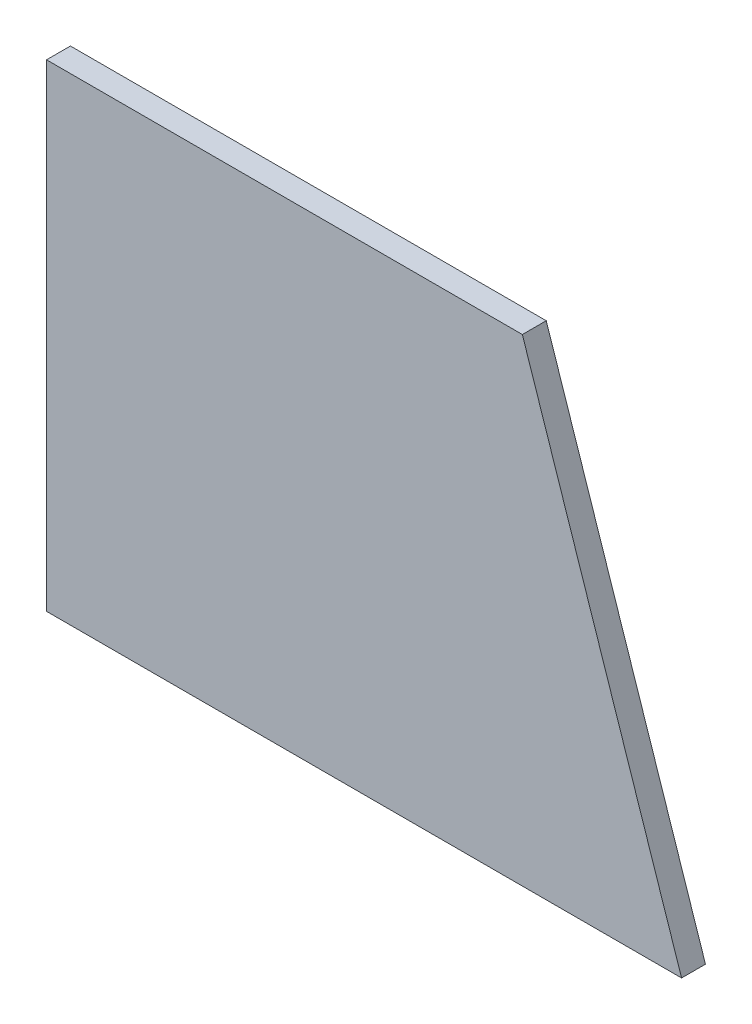
ISO-10303-21;
HEADER;
FILE_DESCRIPTION(('STEP AP214'),'2;1');
FILE_NAME('part.step','',(''),(''),'','','');
FILE_SCHEMA(('AUTOMOTIVE_DESIGN { 1 0 10303 214 1 1 1 1 }'));
ENDSEC;
DATA;
#1=APPLICATION_CONTEXT('core data for automotive mechanical design processes');
#2=APPLICATION_PROTOCOL_DEFINITION('international standard','automotive_design',2000,#1);
#3=PRODUCT_CONTEXT('',#1,'mechanical');
#4=PRODUCT('Part','Part','',(#3));
#5=PRODUCT_RELATED_PRODUCT_CATEGORY('part','',(#4));
#6=PRODUCT_DEFINITION_FORMATION('','',#4);
#7=PRODUCT_DEFINITION_CONTEXT('part definition',#1,'design');
#8=PRODUCT_DEFINITION('design','',#6,#7);
#9=PRODUCT_DEFINITION_SHAPE('','',#8);
#10=(LENGTH_UNIT() NAMED_UNIT(*) SI_UNIT(.MILLI.,.METRE.));
#11=(NAMED_UNIT(*) PLANE_ANGLE_UNIT() SI_UNIT($,.RADIAN.));
#12=(NAMED_UNIT(*) SI_UNIT($,.STERADIAN.) SOLID_ANGLE_UNIT());
#13=UNCERTAINTY_MEASURE_WITH_UNIT(LENGTH_MEASURE(1.E-05),#10,'distance_accuracy_value','');
#14=(GEOMETRIC_REPRESENTATION_CONTEXT(3) GLOBAL_UNCERTAINTY_ASSIGNED_CONTEXT((#13)) GLOBAL_UNIT_ASSIGNED_CONTEXT((#10,
#11,#12)) REPRESENTATION_CONTEXT('',''));
#15=CARTESIAN_POINT('',(0.,0.,0.));
#16=DIRECTION('',(0.,0.,1.));
#17=DIRECTION('',(1.,0.,0.));
#18=AXIS2_PLACEMENT_3D('',#15,#16,#17);
#19=CARTESIAN_POINT('',(-0.3,-0.25,0.015));
#20=DIRECTION('',(1.,0.,0.));
#21=DIRECTION('',(0.,0.,-1.));
#22=AXIS2_PLACEMENT_3D('',#19,#20,#21);
#23=PLANE('',#22);
#24=DIRECTION('',(0.,-1.,0.));
#25=VECTOR('',#24,1.);
#26=CARTESIAN_POINT('',(-0.3,-0.25,-0.015));
#27=LINE('',#26,#25);
#28=CARTESIAN_POINT('',(-0.3,0.35,-0.015));
#29=VERTEX_POINT('',#28);
#30=CARTESIAN_POINT('',(-0.3,-0.25,-0.015));
#31=VERTEX_POINT('',#30);
#32=EDGE_CURVE('E87',#29,#31,#27,.T.);
#33=ORIENTED_EDGE('',*,*,#32,.T.);
#34=DIRECTION('',(0.,0.,-1.));
#35=VECTOR('',#34,1.);
#36=CARTESIAN_POINT('',(-0.3,-0.25,0.015));
#37=LINE('',#36,#35);
#38=CARTESIAN_POINT('',(-0.3,-0.25,0.015));
#39=VERTEX_POINT('',#38);
#40=EDGE_CURVE('E41',#39,#31,#37,.T.);
#41=ORIENTED_EDGE('',*,*,#40,.F.);
#42=DIRECTION('',(0.,-1.,0.));
#43=VECTOR('',#42,1.);
#44=CARTESIAN_POINT('',(-0.3,-0.25,0.015));
#45=LINE('',#44,#43);
#46=CARTESIAN_POINT('',(-0.3,0.35,0.015));
#47=VERTEX_POINT('',#46);
#48=EDGE_CURVE('E80',#47,#39,#45,.T.);
#49=ORIENTED_EDGE('',*,*,#48,.F.);
#50=DIRECTION('',(0.,0.,-1.));
#51=VECTOR('',#50,1.);
#52=CARTESIAN_POINT('',(-0.3,0.35,0.015));
#53=LINE('',#52,#51);
#54=EDGE_CURVE('E11',#47,#29,#53,.T.);
#55=ORIENTED_EDGE('',*,*,#54,.T.);
#56=EDGE_LOOP('',(#33,#41,#49,#55));
#57=FACE_BOUND('',#56,.T.);
#58=ADVANCED_FACE('F33',(#57),#23,.F.);
#59=CARTESIAN_POINT('',(0.497683813287983,-0.25,0.015));
#60=DIRECTION('',(0.,1.,0.));
#61=DIRECTION('',(-1.,0.,0.));
#62=AXIS2_PLACEMENT_3D('',#59,#60,#61);
#63=PLANE('',#62);
#64=DIRECTION('',(1.,0.,0.));
#65=VECTOR('',#64,1.);
#66=CARTESIAN_POINT('',(0.497683813287983,-0.25,-0.015));
#67=LINE('',#66,#65);
#68=CARTESIAN_POINT('',(0.497683813287983,-0.25,-0.015));
#69=VERTEX_POINT('',#68);
#70=EDGE_CURVE('E67',#31,#69,#67,.T.);
#71=ORIENTED_EDGE('',*,*,#70,.T.);
#72=DIRECTION('',(0.,0.,-1.));
#73=VECTOR('',#72,1.);
#74=CARTESIAN_POINT('',(0.497683813287983,-0.25,0.015));
#75=LINE('',#74,#73);
#76=CARTESIAN_POINT('',(0.497683813287983,-0.25,0.015));
#77=VERTEX_POINT('',#76);
#78=EDGE_CURVE('E88',#77,#69,#75,.T.);
#79=ORIENTED_EDGE('',*,*,#78,.F.);
#80=DIRECTION('',(1.,0.,0.));
#81=VECTOR('',#80,1.);
#82=CARTESIAN_POINT('',(0.497683813287983,-0.25,0.015));
#83=LINE('',#82,#81);
#84=EDGE_CURVE('E84',#39,#77,#83,.T.);
#85=ORIENTED_EDGE('',*,*,#84,.F.);
#86=ORIENTED_EDGE('',*,*,#40,.T.);
#87=EDGE_LOOP('',(#71,#79,#85,#86));
#88=FACE_BOUND('',#87,.T.);
#89=ADVANCED_FACE('F89',(#88),#63,.F.);
#90=CARTESIAN_POINT('',(0.297683813287983,0.35,0.015));
#91=DIRECTION('',(-0.948683298050514,-0.316227766016838,0.));
#92=DIRECTION('',(0.316227766016838,-0.948683298050514,0.));
#93=AXIS2_PLACEMENT_3D('',#90,#91,#92);
#94=PLANE('',#93);
#95=DIRECTION('',(-0.316227766016838,0.948683298050514,0.));
#96=VECTOR('',#95,1.);
#97=CARTESIAN_POINT('',(0.297683813287983,0.35,-0.015));
#98=LINE('',#97,#96);
#99=CARTESIAN_POINT('',(0.297683813287983,0.35,-0.015));
#100=VERTEX_POINT('',#99);
#101=EDGE_CURVE('E74',#69,#100,#98,.T.);
#102=ORIENTED_EDGE('',*,*,#101,.T.);
#103=DIRECTION('',(0.,0.,-1.));
#104=VECTOR('',#103,1.);
#105=CARTESIAN_POINT('',(0.297683813287983,0.35,0.015));
#106=LINE('',#105,#104);
#107=CARTESIAN_POINT('',(0.297683813287983,0.35,0.015));
#108=VERTEX_POINT('',#107);
#109=EDGE_CURVE('E93',#108,#100,#106,.T.);
#110=ORIENTED_EDGE('',*,*,#109,.F.);
#111=DIRECTION('',(-0.316227766016838,0.948683298050514,0.));
#112=VECTOR('',#111,1.);
#113=CARTESIAN_POINT('',(0.297683813287983,0.35,0.015));
#114=LINE('',#113,#112);
#115=EDGE_CURVE('E91',#77,#108,#114,.T.);
#116=ORIENTED_EDGE('',*,*,#115,.F.);
#117=ORIENTED_EDGE('',*,*,#78,.T.);
#118=EDGE_LOOP('',(#102,#110,#116,#117));
#119=FACE_BOUND('',#118,.T.);
#120=ADVANCED_FACE('F103',(#119),#94,.F.);
#121=CARTESIAN_POINT('',(0.,0.35,0.015));
#122=DIRECTION('',(0.,-1.,0.));
#123=DIRECTION('',(0.,0.,-1.));
#124=AXIS2_PLACEMENT_3D('',#121,#122,#123);
#125=PLANE('',#124);
#126=DIRECTION('',(-1.,0.,0.));
#127=VECTOR('',#126,1.);
#128=CARTESIAN_POINT('',(0.,0.35,-0.015));
#129=LINE('',#128,#127);
#130=EDGE_CURVE('E100',#100,#29,#129,.T.);
#131=ORIENTED_EDGE('',*,*,#130,.T.);
#132=ORIENTED_EDGE('',*,*,#54,.F.);
#133=DIRECTION('',(-1.,0.,0.));
#134=VECTOR('',#133,1.);
#135=CARTESIAN_POINT('',(-0.3,0.35,0.015));
#136=LINE('',#135,#134);
#137=EDGE_CURVE('E49',#108,#47,#136,.T.);
#138=ORIENTED_EDGE('',*,*,#137,.F.);
#139=ORIENTED_EDGE('',*,*,#109,.T.);
#140=EDGE_LOOP('',(#131,#132,#138,#139));
#141=FACE_BOUND('',#140,.T.);
#142=ADVANCED_FACE('F107',(#141),#125,.F.);
#143=CARTESIAN_POINT('',(0.,0.,0.015));
#144=DIRECTION('',(0.,0.,1.));
#145=DIRECTION('',(1.,0.,0.));
#146=AXIS2_PLACEMENT_3D('',#143,#144,#145);
#147=PLANE('',#146);
#148=ORIENTED_EDGE('',*,*,#137,.T.);
#149=ORIENTED_EDGE('',*,*,#48,.T.);
#150=ORIENTED_EDGE('',*,*,#84,.T.);
#151=ORIENTED_EDGE('',*,*,#115,.T.);
#152=EDGE_LOOP('',(#148,#149,#150,#151));
#153=FACE_BOUND('',#152,.T.);
#154=ADVANCED_FACE('F82',(#153),#147,.T.);
#155=CARTESIAN_POINT('',(0.,0.,-0.015));
#156=DIRECTION('',(0.,0.,1.));
#157=DIRECTION('',(1.,0.,0.));
#158=AXIS2_PLACEMENT_3D('',#155,#156,#157);
#159=PLANE('',#158);
#160=ORIENTED_EDGE('',*,*,#32,.F.);
#161=ORIENTED_EDGE('',*,*,#130,.F.);
#162=ORIENTED_EDGE('',*,*,#101,.F.);
#163=ORIENTED_EDGE('',*,*,#70,.F.);
#164=EDGE_LOOP('',(#160,#161,#162,#163));
#165=FACE_BOUND('',#164,.T.);
#166=ADVANCED_FACE('F106',(#165),#159,.F.);
#167=CLOSED_SHELL('',(#58,#89,#120,#142,#154,#166));
#168=MANIFOLD_SOLID_BREP('B2',#167);
#169=ADVANCED_BREP_SHAPE_REPRESENTATION('',(#18,#168),#14);
#170=SHAPE_DEFINITION_REPRESENTATION(#9,#169);
ENDSEC;
END-ISO-10303-21;
